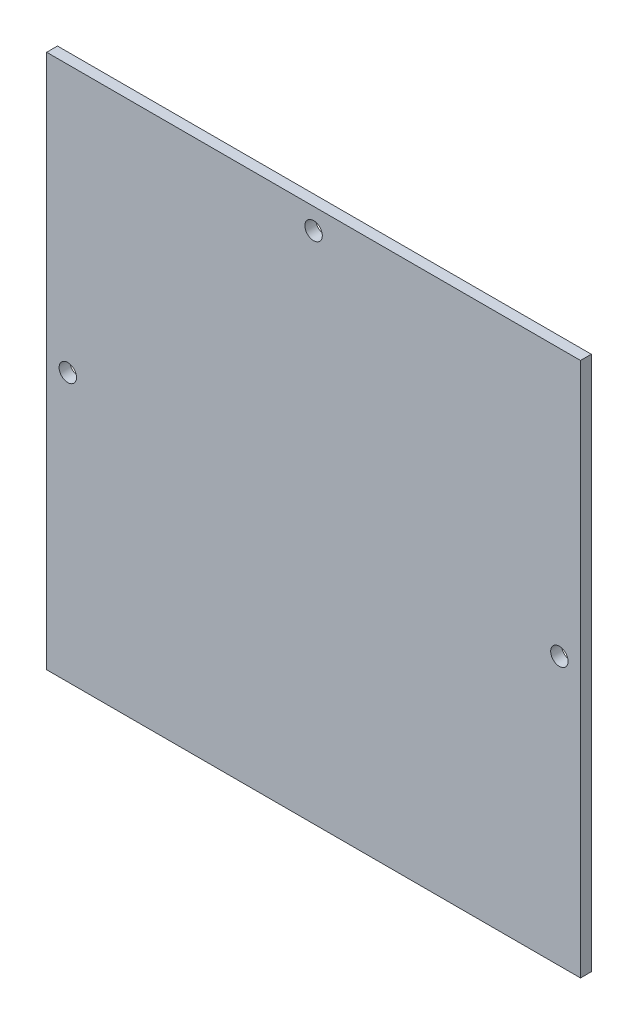
ISO-10303-21;
HEADER;
FILE_DESCRIPTION(('STEP AP214'),'2;1');
FILE_NAME('part.step','',(''),(''),'','','');
FILE_SCHEMA(('AUTOMOTIVE_DESIGN { 1 0 10303 214 1 1 1 1 }'));
ENDSEC;
DATA;
#1=APPLICATION_CONTEXT('core data for automotive mechanical design processes');
#2=APPLICATION_PROTOCOL_DEFINITION('international standard','automotive_design',2000,#1);
#3=PRODUCT_CONTEXT('',#1,'mechanical');
#4=PRODUCT('Part','Part','',(#3));
#5=PRODUCT_RELATED_PRODUCT_CATEGORY('part','',(#4));
#6=PRODUCT_DEFINITION_FORMATION('','',#4);
#7=PRODUCT_DEFINITION_CONTEXT('part definition',#1,'design');
#8=PRODUCT_DEFINITION('design','',#6,#7);
#9=PRODUCT_DEFINITION_SHAPE('','',#8);
#10=(LENGTH_UNIT() NAMED_UNIT(*) SI_UNIT(.MILLI.,.METRE.));
#11=(NAMED_UNIT(*) PLANE_ANGLE_UNIT() SI_UNIT($,.RADIAN.));
#12=(NAMED_UNIT(*) SI_UNIT($,.STERADIAN.) SOLID_ANGLE_UNIT());
#13=UNCERTAINTY_MEASURE_WITH_UNIT(LENGTH_MEASURE(1.E-05),#10,'distance_accuracy_value','');
#14=(GEOMETRIC_REPRESENTATION_CONTEXT(3) GLOBAL_UNCERTAINTY_ASSIGNED_CONTEXT((#13)) GLOBAL_UNIT_ASSIGNED_CONTEXT((#10,
#11,#12)) REPRESENTATION_CONTEXT('',''));
#15=CARTESIAN_POINT('',(0.,0.,0.));
#16=DIRECTION('',(0.,0.,1.));
#17=DIRECTION('',(1.,0.,0.));
#18=AXIS2_PLACEMENT_3D('',#15,#16,#17);
#19=CARTESIAN_POINT('',(0.,0.,1.8));
#20=DIRECTION('',(1.,0.,0.));
#21=DIRECTION('',(0.,0.,-1.));
#22=AXIS2_PLACEMENT_3D('',#19,#20,#21);
#23=PLANE('',#22);
#24=DIRECTION('',(0.,-1.,0.));
#25=VECTOR('',#24,1.);
#26=CARTESIAN_POINT('',(0.,0.,0.));
#27=LINE('',#26,#25);
#28=CARTESIAN_POINT('',(0.,89.025,0.));
#29=VERTEX_POINT('',#28);
#30=CARTESIAN_POINT('',(0.,0.,0.));
#31=VERTEX_POINT('',#30);
#32=EDGE_CURVE('E99',#29,#31,#27,.T.);
#33=ORIENTED_EDGE('',*,*,#32,.T.);
#34=DIRECTION('',(0.,0.,-1.));
#35=VECTOR('',#34,1.);
#36=CARTESIAN_POINT('',(0.,0.,1.8));
#37=LINE('',#36,#35);
#38=CARTESIAN_POINT('',(0.,0.,1.8));
#39=VERTEX_POINT('',#38);
#40=EDGE_CURVE('E11',#39,#31,#37,.T.);
#41=ORIENTED_EDGE('',*,*,#40,.F.);
#42=DIRECTION('',(0.,-1.,0.));
#43=VECTOR('',#42,1.);
#44=CARTESIAN_POINT('',(0.,0.,1.8));
#45=LINE('',#44,#43);
#46=CARTESIAN_POINT('',(0.,89.025,1.8));
#47=VERTEX_POINT('',#46);
#48=EDGE_CURVE('E86',#47,#39,#45,.T.);
#49=ORIENTED_EDGE('',*,*,#48,.F.);
#50=DIRECTION('',(0.,0.,-1.));
#51=VECTOR('',#50,1.);
#52=CARTESIAN_POINT('',(0.,89.025,1.8));
#53=LINE('',#52,#51);
#54=EDGE_CURVE('E95',#47,#29,#53,.T.);
#55=ORIENTED_EDGE('',*,*,#54,.T.);
#56=EDGE_LOOP('',(#33,#41,#49,#55));
#57=FACE_BOUND('',#56,.T.);
#58=ADVANCED_FACE('F34',(#57),#23,.F.);
#59=CARTESIAN_POINT('',(0.,0.,1.8));
#60=DIRECTION('',(0.,1.,0.));
#61=DIRECTION('',(0.,0.,1.));
#62=AXIS2_PLACEMENT_3D('',#59,#60,#61);
#63=PLANE('',#62);
#64=DIRECTION('',(1.,0.,0.));
#65=VECTOR('',#64,1.);
#66=CARTESIAN_POINT('',(0.,0.,0.));
#67=LINE('',#66,#65);
#68=CARTESIAN_POINT('',(88.865,0.,0.));
#69=VERTEX_POINT('',#68);
#70=EDGE_CURVE('E90',#31,#69,#67,.T.);
#71=ORIENTED_EDGE('',*,*,#70,.T.);
#72=DIRECTION('',(0.,0.,-1.));
#73=VECTOR('',#72,1.);
#74=CARTESIAN_POINT('',(88.865,0.,1.8));
#75=LINE('',#74,#73);
#76=CARTESIAN_POINT('',(88.865,0.,1.8));
#77=VERTEX_POINT('',#76);
#78=EDGE_CURVE('E43',#77,#69,#75,.T.);
#79=ORIENTED_EDGE('',*,*,#78,.F.);
#80=DIRECTION('',(1.,0.,0.));
#81=VECTOR('',#80,1.);
#82=CARTESIAN_POINT('',(0.,0.,1.8));
#83=LINE('',#82,#81);
#84=EDGE_CURVE('E81',#39,#77,#83,.T.);
#85=ORIENTED_EDGE('',*,*,#84,.F.);
#86=ORIENTED_EDGE('',*,*,#40,.T.);
#87=EDGE_LOOP('',(#71,#79,#85,#86));
#88=FACE_BOUND('',#87,.T.);
#89=ADVANCED_FACE('F89',(#88),#63,.F.);
#90=CARTESIAN_POINT('',(88.865,0.,1.8));
#91=DIRECTION('',(-1.,0.,0.));
#92=DIRECTION('',(0.,0.,1.));
#93=AXIS2_PLACEMENT_3D('',#90,#91,#92);
#94=PLANE('',#93);
#95=DIRECTION('',(0.,1.,0.));
#96=VECTOR('',#95,1.);
#97=CARTESIAN_POINT('',(88.865,0.,0.));
#98=LINE('',#97,#96);
#99=CARTESIAN_POINT('',(88.865,89.025,0.));
#100=VERTEX_POINT('',#99);
#101=EDGE_CURVE('E68',#69,#100,#98,.T.);
#102=ORIENTED_EDGE('',*,*,#101,.T.);
#103=DIRECTION('',(0.,0.,-1.));
#104=VECTOR('',#103,1.);
#105=CARTESIAN_POINT('',(88.865,89.025,1.8));
#106=LINE('',#105,#104);
#107=CARTESIAN_POINT('',(88.865,89.025,1.8));
#108=VERTEX_POINT('',#107);
#109=EDGE_CURVE('E91',#108,#100,#106,.T.);
#110=ORIENTED_EDGE('',*,*,#109,.F.);
#111=DIRECTION('',(0.,1.,0.));
#112=VECTOR('',#111,1.);
#113=CARTESIAN_POINT('',(88.865,0.,1.8));
#114=LINE('',#113,#112);
#115=EDGE_CURVE('E84',#77,#108,#114,.T.);
#116=ORIENTED_EDGE('',*,*,#115,.F.);
#117=ORIENTED_EDGE('',*,*,#78,.T.);
#118=EDGE_LOOP('',(#102,#110,#116,#117));
#119=FACE_BOUND('',#118,.T.);
#120=ADVANCED_FACE('F93',(#119),#94,.F.);
#121=CARTESIAN_POINT('',(0.,89.025,1.8));
#122=DIRECTION('',(0.,-1.,0.));
#123=DIRECTION('',(0.,0.,-1.));
#124=AXIS2_PLACEMENT_3D('',#121,#122,#123);
#125=PLANE('',#124);
#126=DIRECTION('',(-1.,0.,0.));
#127=VECTOR('',#126,1.);
#128=CARTESIAN_POINT('',(0.,89.025,0.));
#129=LINE('',#128,#127);
#130=EDGE_CURVE('E74',#100,#29,#129,.T.);
#131=ORIENTED_EDGE('',*,*,#130,.T.);
#132=ORIENTED_EDGE('',*,*,#54,.F.);
#133=DIRECTION('',(-1.,0.,0.));
#134=VECTOR('',#133,1.);
#135=CARTESIAN_POINT('',(0.,89.025,1.8));
#136=LINE('',#135,#134);
#137=EDGE_CURVE('E51',#108,#47,#136,.T.);
#138=ORIENTED_EDGE('',*,*,#137,.F.);
#139=ORIENTED_EDGE('',*,*,#109,.T.);
#140=EDGE_LOOP('',(#131,#132,#138,#139));
#141=FACE_BOUND('',#140,.T.);
#142=ADVANCED_FACE('F106',(#141),#125,.F.);
#143=CARTESIAN_POINT('',(0.,0.,1.8));
#144=DIRECTION('',(0.,0.,-1.));
#145=DIRECTION('',(-1.,0.,0.));
#146=AXIS2_PLACEMENT_3D('',#143,#144,#145);
#147=PLANE('',#146);
#148=CARTESIAN_POINT('',(44.4325,85.525,1.8));
#149=DIRECTION('',(0.,0.,1.));
#150=DIRECTION('',(1.,0.,0.));
#151=AXIS2_PLACEMENT_3D('',#148,#149,#150);
#152=CIRCLE('',#151,1.44999999999999);
#153=CARTESIAN_POINT('',(45.8825,85.525,1.8));
#154=VERTEX_POINT('',#153);
#155=EDGE_CURVE('E124',#154,#154,#152,.T.);
#156=ORIENTED_EDGE('',*,*,#155,.F.);
#157=EDGE_LOOP('',(#156));
#158=FACE_BOUND('',#157,.T.);
#159=CARTESIAN_POINT('',(3.52,44.6125,1.8));
#160=DIRECTION('',(0.,0.,1.));
#161=DIRECTION('',(1.,0.,0.));
#162=AXIS2_PLACEMENT_3D('',#159,#160,#161);
#163=CIRCLE('',#162,1.44999999999999);
#164=CARTESIAN_POINT('',(4.96999999999998,44.6125,1.8));
#165=VERTEX_POINT('',#164);
#166=EDGE_CURVE('E118',#165,#165,#163,.T.);
#167=ORIENTED_EDGE('',*,*,#166,.F.);
#168=EDGE_LOOP('',(#167));
#169=FACE_BOUND('',#168,.T.);
#170=CARTESIAN_POINT('',(85.345,44.6125,1.8));
#171=DIRECTION('',(0.,0.,1.));
#172=DIRECTION('',(1.,0.,0.));
#173=AXIS2_PLACEMENT_3D('',#170,#171,#172);
#174=CIRCLE('',#173,1.44999999999999);
#175=CARTESIAN_POINT('',(86.795,44.6125,1.8));
#176=VERTEX_POINT('',#175);
#177=EDGE_CURVE('E112',#176,#176,#174,.T.);
#178=ORIENTED_EDGE('',*,*,#177,.F.);
#179=EDGE_LOOP('',(#178));
#180=FACE_BOUND('',#179,.T.);
#181=ORIENTED_EDGE('',*,*,#48,.T.);
#182=ORIENTED_EDGE('',*,*,#84,.T.);
#183=ORIENTED_EDGE('',*,*,#115,.T.);
#184=ORIENTED_EDGE('',*,*,#137,.T.);
#185=EDGE_LOOP('',(#181,#182,#183,#184));
#186=FACE_BOUND('',#185,.T.);
#187=ADVANCED_FACE('F82',(#158,#169,#180,#186),#147,.F.);
#188=CARTESIAN_POINT('',(0.,0.,0.));
#189=DIRECTION('',(0.,0.,-1.));
#190=DIRECTION('',(-1.,0.,0.));
#191=AXIS2_PLACEMENT_3D('',#188,#189,#190);
#192=PLANE('',#191);
#193=CARTESIAN_POINT('',(44.4325,85.525,0.));
#194=DIRECTION('',(0.,0.,-1.));
#195=DIRECTION('',(-1.,0.,0.));
#196=AXIS2_PLACEMENT_3D('',#193,#194,#195);
#197=CIRCLE('',#196,1.44999999999999);
#198=CARTESIAN_POINT('',(42.9825,85.525,0.));
#199=VERTEX_POINT('',#198);
#200=EDGE_CURVE('E121',#199,#199,#197,.T.);
#201=ORIENTED_EDGE('',*,*,#200,.F.);
#202=EDGE_LOOP('',(#201));
#203=FACE_BOUND('',#202,.T.);
#204=CARTESIAN_POINT('',(3.52,44.6125,0.));
#205=DIRECTION('',(0.,0.,-1.));
#206=DIRECTION('',(-1.,0.,0.));
#207=AXIS2_PLACEMENT_3D('',#204,#205,#206);
#208=CIRCLE('',#207,1.44999999999999);
#209=CARTESIAN_POINT('',(2.07,44.6125,0.));
#210=VERTEX_POINT('',#209);
#211=EDGE_CURVE('E115',#210,#210,#208,.T.);
#212=ORIENTED_EDGE('',*,*,#211,.F.);
#213=EDGE_LOOP('',(#212));
#214=FACE_BOUND('',#213,.T.);
#215=CARTESIAN_POINT('',(85.345,44.6125,0.));
#216=DIRECTION('',(0.,0.,-1.));
#217=DIRECTION('',(-1.,0.,0.));
#218=AXIS2_PLACEMENT_3D('',#215,#216,#217);
#219=CIRCLE('',#218,1.44999999999999);
#220=CARTESIAN_POINT('',(83.895,44.6125,0.));
#221=VERTEX_POINT('',#220);
#222=EDGE_CURVE('E37',#221,#221,#219,.T.);
#223=ORIENTED_EDGE('',*,*,#222,.F.);
#224=EDGE_LOOP('',(#223));
#225=FACE_BOUND('',#224,.T.);
#226=ORIENTED_EDGE('',*,*,#32,.F.);
#227=ORIENTED_EDGE('',*,*,#130,.F.);
#228=ORIENTED_EDGE('',*,*,#101,.F.);
#229=ORIENTED_EDGE('',*,*,#70,.F.);
#230=EDGE_LOOP('',(#226,#227,#228,#229));
#231=FACE_BOUND('',#230,.T.);
#232=ADVANCED_FACE('F109',(#203,#214,#225,#231),#192,.T.);
#233=CARTESIAN_POINT('',(85.345,44.6125,1.8));
#234=DIRECTION('',(0.,0.,1.));
#235=DIRECTION('',(1.,0.,0.));
#236=AXIS2_PLACEMENT_3D('',#233,#234,#235);
#237=CYLINDRICAL_SURFACE('',#236,1.44999999999999);
#238=ORIENTED_EDGE('',*,*,#222,.T.);
#239=EDGE_LOOP('',(#238));
#240=FACE_BOUND('',#239,.T.);
#241=ORIENTED_EDGE('',*,*,#177,.T.);
#242=EDGE_LOOP('',(#241));
#243=FACE_BOUND('',#242,.T.);
#244=ADVANCED_FACE('F137',(#240,#243),#237,.F.);
#245=CARTESIAN_POINT('',(3.52,44.6125,1.8));
#246=DIRECTION('',(0.,0.,1.));
#247=DIRECTION('',(1.,0.,0.));
#248=AXIS2_PLACEMENT_3D('',#245,#246,#247);
#249=CYLINDRICAL_SURFACE('',#248,1.44999999999999);
#250=ORIENTED_EDGE('',*,*,#211,.T.);
#251=EDGE_LOOP('',(#250));
#252=FACE_BOUND('',#251,.T.);
#253=ORIENTED_EDGE('',*,*,#166,.T.);
#254=EDGE_LOOP('',(#253));
#255=FACE_BOUND('',#254,.T.);
#256=ADVANCED_FACE('F139',(#252,#255),#249,.F.);
#257=CARTESIAN_POINT('',(44.4325,85.525,1.8));
#258=DIRECTION('',(0.,0.,1.));
#259=DIRECTION('',(1.,0.,0.));
#260=AXIS2_PLACEMENT_3D('',#257,#258,#259);
#261=CYLINDRICAL_SURFACE('',#260,1.44999999999999);
#262=ORIENTED_EDGE('',*,*,#200,.T.);
#263=EDGE_LOOP('',(#262));
#264=FACE_BOUND('',#263,.T.);
#265=ORIENTED_EDGE('',*,*,#155,.T.);
#266=EDGE_LOOP('',(#265));
#267=FACE_BOUND('',#266,.T.);
#268=ADVANCED_FACE('F128',(#264,#267),#261,.F.);
#269=CLOSED_SHELL('',(#58,#89,#120,#142,#187,#232,#244,#256,#268));
#270=MANIFOLD_SOLID_BREP('B2',#269);
#271=ADVANCED_BREP_SHAPE_REPRESENTATION('',(#18,#270),#14);
#272=SHAPE_DEFINITION_REPRESENTATION(#9,#271);
ENDSEC;
END-ISO-10303-21;
